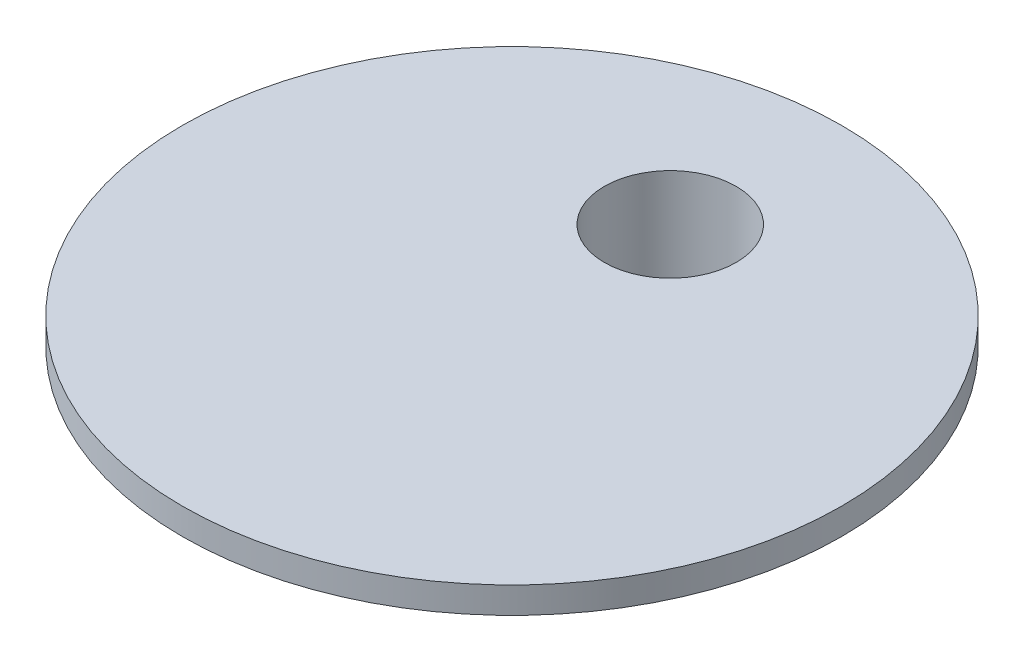
ISO-10303-21;
HEADER;
FILE_DESCRIPTION(('STEP AP214'),'2;1');
FILE_NAME('part.step','',(''),(''),'','','');
FILE_SCHEMA(('AUTOMOTIVE_DESIGN { 1 0 10303 214 1 1 1 1 }'));
ENDSEC;
DATA;
#1=APPLICATION_CONTEXT('core data for automotive mechanical design processes');
#2=APPLICATION_PROTOCOL_DEFINITION('international standard','automotive_design',2000,#1);
#3=PRODUCT_CONTEXT('',#1,'mechanical');
#4=PRODUCT('Part','Part','',(#3));
#5=PRODUCT_RELATED_PRODUCT_CATEGORY('part','',(#4));
#6=PRODUCT_DEFINITION_FORMATION('','',#4);
#7=PRODUCT_DEFINITION_CONTEXT('part definition',#1,'design');
#8=PRODUCT_DEFINITION('design','',#6,#7);
#9=PRODUCT_DEFINITION_SHAPE('','',#8);
#10=(LENGTH_UNIT() NAMED_UNIT(*) SI_UNIT(.MILLI.,.METRE.));
#11=(NAMED_UNIT(*) PLANE_ANGLE_UNIT() SI_UNIT($,.RADIAN.));
#12=(NAMED_UNIT(*) SI_UNIT($,.STERADIAN.) SOLID_ANGLE_UNIT());
#13=UNCERTAINTY_MEASURE_WITH_UNIT(LENGTH_MEASURE(1.E-05),#10,'distance_accuracy_value','');
#14=(GEOMETRIC_REPRESENTATION_CONTEXT(3) GLOBAL_UNCERTAINTY_ASSIGNED_CONTEXT((#13)) GLOBAL_UNIT_ASSIGNED_CONTEXT((#10,
#11,#12)) REPRESENTATION_CONTEXT('',''));
#15=CARTESIAN_POINT('',(0.,0.,0.));
#16=DIRECTION('',(0.,0.,1.));
#17=DIRECTION('',(1.,0.,0.));
#18=AXIS2_PLACEMENT_3D('',#15,#16,#17);
#19=CARTESIAN_POINT('',(0.,0.,0.));
#20=DIRECTION('',(0.,1.,0.));
#21=DIRECTION('',(0.,0.,1.));
#22=AXIS2_PLACEMENT_3D('',#19,#20,#21);
#23=PLANE('',#22);
#24=CARTESIAN_POINT('',(0.,0.,0.));
#25=DIRECTION('',(0.,1.,0.));
#26=DIRECTION('',(0.,0.,1.));
#27=AXIS2_PLACEMENT_3D('',#24,#25,#26);
#28=CIRCLE('',#27,125.);
#29=CARTESIAN_POINT('',(0.,0.,125.));
#30=VERTEX_POINT('',#29);
#31=EDGE_CURVE('E42',#30,#30,#28,.T.);
#32=ORIENTED_EDGE('',*,*,#31,.F.);
#33=EDGE_LOOP('',(#32));
#34=FACE_BOUND('',#33,.T.);
#35=CARTESIAN_POINT('',(0.,0.,-60.));
#36=DIRECTION('',(0.,1.,0.));
#37=DIRECTION('',(0.,0.,1.));
#38=AXIS2_PLACEMENT_3D('',#35,#36,#37);
#39=CIRCLE('',#38,30.);
#40=CARTESIAN_POINT('',(0.,0.,-30.));
#41=VERTEX_POINT('',#40);
#42=EDGE_CURVE('E10',#41,#41,#39,.F.);
#43=ORIENTED_EDGE('',*,*,#42,.F.);
#44=EDGE_LOOP('',(#43));
#45=FACE_BOUND('',#44,.T.);
#46=ADVANCED_FACE('F31',(#34,#45),#23,.F.);
#47=CARTESIAN_POINT('',(0.,10.,0.));
#48=DIRECTION('',(0.,1.,0.));
#49=DIRECTION('',(0.,0.,1.));
#50=AXIS2_PLACEMENT_3D('',#47,#48,#49);
#51=PLANE('',#50);
#52=CARTESIAN_POINT('',(0.,10.,0.));
#53=DIRECTION('',(0.,1.,0.));
#54=DIRECTION('',(0.,0.,1.));
#55=AXIS2_PLACEMENT_3D('',#52,#53,#54);
#56=CIRCLE('',#55,125.);
#57=CARTESIAN_POINT('',(0.,10.,125.));
#58=VERTEX_POINT('',#57);
#59=EDGE_CURVE('E38',#58,#58,#56,.T.);
#60=ORIENTED_EDGE('',*,*,#59,.T.);
#61=EDGE_LOOP('',(#60));
#62=FACE_BOUND('',#61,.T.);
#63=CARTESIAN_POINT('',(0.,10.,-60.));
#64=DIRECTION('',(0.,1.,0.));
#65=DIRECTION('',(0.,0.,1.));
#66=AXIS2_PLACEMENT_3D('',#63,#64,#65);
#67=CIRCLE('',#66,25.);
#68=CARTESIAN_POINT('',(0.,10.,-35.));
#69=VERTEX_POINT('',#68);
#70=EDGE_CURVE('E47',#69,#69,#67,.T.);
#71=ORIENTED_EDGE('',*,*,#70,.F.);
#72=EDGE_LOOP('',(#71));
#73=FACE_BOUND('',#72,.T.);
#74=ADVANCED_FACE('F74',(#62,#73),#51,.T.);
#75=CARTESIAN_POINT('',(0.,10.,0.));
#76=DIRECTION('',(0.,-1.,0.));
#77=DIRECTION('',(0.,0.,-1.));
#78=AXIS2_PLACEMENT_3D('',#75,#76,#77);
#79=CYLINDRICAL_SURFACE('',#78,125.);
#80=ORIENTED_EDGE('',*,*,#59,.F.);
#81=EDGE_LOOP('',(#80));
#82=FACE_BOUND('',#81,.T.);
#83=ORIENTED_EDGE('',*,*,#31,.T.);
#84=EDGE_LOOP('',(#83));
#85=FACE_BOUND('',#84,.T.);
#86=ADVANCED_FACE('F33',(#82,#85),#79,.T.);
#87=CARTESIAN_POINT('',(0.,10.,-60.));
#88=DIRECTION('',(0.,-1.,0.));
#89=DIRECTION('',(0.,0.,-1.));
#90=AXIS2_PLACEMENT_3D('',#87,#88,#89);
#91=CYLINDRICAL_SURFACE('',#90,25.);
#92=ORIENTED_EDGE('',*,*,#70,.T.);
#93=EDGE_LOOP('',(#92));
#94=FACE_BOUND('',#93,.T.);
#95=CARTESIAN_POINT('',(0.,-85.,-60.));
#96=DIRECTION('',(0.,-1.,0.));
#97=DIRECTION('',(0.,0.,-1.));
#98=AXIS2_PLACEMENT_3D('',#95,#96,#97);
#99=CIRCLE('',#98,25.);
#100=CARTESIAN_POINT('',(0.,-85.,-85.));
#101=VERTEX_POINT('',#100);
#102=EDGE_CURVE('E54',#101,#101,#99,.T.);
#103=ORIENTED_EDGE('',*,*,#102,.T.);
#104=EDGE_LOOP('',(#103));
#105=FACE_BOUND('',#104,.T.);
#106=ADVANCED_FACE('F58',(#94,#105),#91,.F.);
#107=CARTESIAN_POINT('',(0.,-85.,-60.));
#108=DIRECTION('',(0.,-1.,0.));
#109=DIRECTION('',(0.,0.,-1.));
#110=AXIS2_PLACEMENT_3D('',#107,#108,#109);
#111=PLANE('',#110);
#112=CARTESIAN_POINT('',(0.,-85.,-60.));
#113=DIRECTION('',(0.,-1.,0.));
#114=DIRECTION('',(0.,0.,-1.));
#115=AXIS2_PLACEMENT_3D('',#112,#113,#114);
#116=CIRCLE('',#115,30.);
#117=CARTESIAN_POINT('',(0.,-85.,-90.));
#118=VERTEX_POINT('',#117);
#119=EDGE_CURVE('E51',#118,#118,#116,.T.);
#120=ORIENTED_EDGE('',*,*,#119,.T.);
#121=EDGE_LOOP('',(#120));
#122=FACE_BOUND('',#121,.T.);
#123=ORIENTED_EDGE('',*,*,#102,.F.);
#124=EDGE_LOOP('',(#123));
#125=FACE_BOUND('',#124,.T.);
#126=ADVANCED_FACE('F60',(#122,#125),#111,.T.);
#127=CARTESIAN_POINT('',(0.,-85.,-60.));
#128=DIRECTION('',(0.,1.,0.));
#129=DIRECTION('',(0.,0.,1.));
#130=AXIS2_PLACEMENT_3D('',#127,#128,#129);
#131=CYLINDRICAL_SURFACE('',#130,30.);
#132=ORIENTED_EDGE('',*,*,#119,.F.);
#133=EDGE_LOOP('',(#132));
#134=FACE_BOUND('',#133,.T.);
#135=ORIENTED_EDGE('',*,*,#42,.T.);
#136=EDGE_LOOP('',(#135));
#137=FACE_BOUND('',#136,.T.);
#138=ADVANCED_FACE('F62',(#134,#137),#131,.T.);
#139=CLOSED_SHELL('',(#46,#74,#86,#106,#126,#138));
#140=MANIFOLD_SOLID_BREP('B2',#139);
#141=ADVANCED_BREP_SHAPE_REPRESENTATION('',(#18,#140),#14);
#142=SHAPE_DEFINITION_REPRESENTATION(#9,#141);
ENDSEC;
END-ISO-10303-21;
